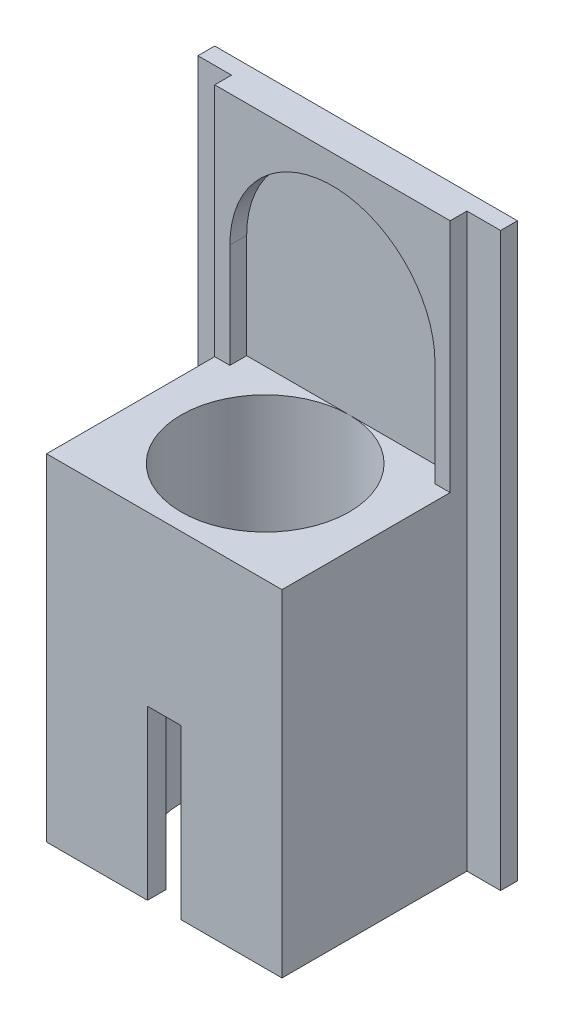
ISO-10303-21;
HEADER;
FILE_DESCRIPTION(('STEP AP214'),'2;1');
FILE_NAME('part.step','',(''),(''),'','','');
FILE_SCHEMA(('AUTOMOTIVE_DESIGN { 1 0 10303 214 1 1 1 1 }'));
ENDSEC;
DATA;
#1=APPLICATION_CONTEXT('core data for automotive mechanical design processes');
#2=APPLICATION_PROTOCOL_DEFINITION('international standard','automotive_design',2000,#1);
#3=PRODUCT_CONTEXT('',#1,'mechanical');
#4=PRODUCT('Part','Part','',(#3));
#5=PRODUCT_RELATED_PRODUCT_CATEGORY('part','',(#4));
#6=PRODUCT_DEFINITION_FORMATION('','',#4);
#7=PRODUCT_DEFINITION_CONTEXT('part definition',#1,'design');
#8=PRODUCT_DEFINITION('design','',#6,#7);
#9=PRODUCT_DEFINITION_SHAPE('','',#8);
#10=(LENGTH_UNIT() NAMED_UNIT(*) SI_UNIT(.MILLI.,.METRE.));
#11=(NAMED_UNIT(*) PLANE_ANGLE_UNIT() SI_UNIT($,.RADIAN.));
#12=(NAMED_UNIT(*) SI_UNIT($,.STERADIAN.) SOLID_ANGLE_UNIT());
#13=UNCERTAINTY_MEASURE_WITH_UNIT(LENGTH_MEASURE(1.E-05),#10,'distance_accuracy_value','');
#14=(GEOMETRIC_REPRESENTATION_CONTEXT(3) GLOBAL_UNCERTAINTY_ASSIGNED_CONTEXT((#13)) GLOBAL_UNIT_ASSIGNED_CONTEXT((#10,
#11,#12)) REPRESENTATION_CONTEXT('',''));
#15=CARTESIAN_POINT('',(0.,0.,0.));
#16=DIRECTION('',(0.,0.,1.));
#17=DIRECTION('',(1.,0.,0.));
#18=AXIS2_PLACEMENT_3D('',#15,#16,#17);
#19=CARTESIAN_POINT('',(0.,0.,5.));
#20=DIRECTION('',(0.,0.,1.));
#21=DIRECTION('',(1.,0.,0.));
#22=AXIS2_PLACEMENT_3D('',#19,#20,#21);
#23=PLANE('',#22);
#24=DIRECTION('',(0.,-1.,0.));
#25=VECTOR('',#24,1.);
#26=CARTESIAN_POINT('',(-745.51799096583,-670.769230769231,5.));
#27=LINE('',#26,#25);
#28=CARTESIAN_POINT('',(-745.51799096583,-500.769230769231,5.));
#29=VERTEX_POINT('',#28);
#30=CARTESIAN_POINT('',(-745.51799096583,-670.769230769231,5.));
#31=VERTEX_POINT('',#30);
#32=EDGE_CURVE('E37',#29,#31,#27,.T.);
#33=ORIENTED_EDGE('',*,*,#32,.F.);
#34=DIRECTION('',(-1.,0.,0.));
#35=VECTOR('',#34,1.);
#36=CARTESIAN_POINT('',(-755.51799096583,-500.769230769231,5.));
#37=LINE('',#36,#35);
#38=CARTESIAN_POINT('',(-755.51799096583,-500.769230769231,5.));
#39=VERTEX_POINT('',#38);
#40=EDGE_CURVE('E298',#29,#39,#37,.T.);
#41=ORIENTED_EDGE('',*,*,#40,.T.);
#42=DIRECTION('',(0.,-1.,0.));
#43=VECTOR('',#42,1.);
#44=CARTESIAN_POINT('',(-755.51799096583,-500.769230769231,5.));
#45=LINE('',#44,#43);
#46=CARTESIAN_POINT('',(-755.51799096583,-670.769230769231,5.));
#47=VERTEX_POINT('',#46);
#48=EDGE_CURVE('E265',#39,#47,#45,.T.);
#49=ORIENTED_EDGE('',*,*,#48,.T.);
#50=DIRECTION('',(1.,0.,0.));
#51=VECTOR('',#50,1.);
#52=CARTESIAN_POINT('',(-755.51799096583,-670.769230769231,5.));
#53=LINE('',#52,#51);
#54=EDGE_CURVE('E278',#47,#31,#53,.T.);
#55=ORIENTED_EDGE('',*,*,#54,.T.);
#56=EDGE_LOOP('',(#33,#41,#49,#55));
#57=FACE_BOUND('',#56,.T.);
#58=ADVANCED_FACE('F33',(#57),#23,.T.);
#59=CARTESIAN_POINT('',(-665.517990965831,-500.769230769231,5.));
#60=VERTEX_POINT('',#59);
#61=CARTESIAN_POINT('',(-675.51799096583,-500.769230769231,5.));
#62=VERTEX_POINT('',#61);
#63=EDGE_CURVE('E288',#60,#62,#37,.T.);
#64=ORIENTED_EDGE('',*,*,#63,.T.);
#65=DIRECTION('',(0.,1.,0.));
#66=VECTOR('',#65,1.);
#67=CARTESIAN_POINT('',(-675.517990965831,-670.769230769231,5.));
#68=LINE('',#67,#66);
#69=CARTESIAN_POINT('',(-675.517990965831,-670.769230769231,5.));
#70=VERTEX_POINT('',#69);
#71=EDGE_CURVE('E249',#70,#62,#68,.T.);
#72=ORIENTED_EDGE('',*,*,#71,.F.);
#73=CARTESIAN_POINT('',(-665.517990965831,-670.769230769231,5.));
#74=VERTEX_POINT('',#73);
#75=EDGE_CURVE('E268',#70,#74,#53,.T.);
#76=ORIENTED_EDGE('',*,*,#75,.T.);
#77=DIRECTION('',(0.,1.,0.));
#78=VECTOR('',#77,1.);
#79=CARTESIAN_POINT('',(-665.517990965831,-500.769230769231,5.));
#80=LINE('',#79,#78);
#81=EDGE_CURVE('E272',#74,#60,#80,.T.);
#82=ORIENTED_EDGE('',*,*,#81,.T.);
#83=EDGE_LOOP('',(#64,#72,#76,#82));
#84=FACE_BOUND('',#83,.T.);
#85=ADVANCED_FACE('F306',(#84),#23,.T.);
#86=CARTESIAN_POINT('',(-755.51799096583,-500.769230769231,5.));
#87=DIRECTION('',(1.,0.,0.));
#88=DIRECTION('',(0.,1.,0.));
#89=AXIS2_PLACEMENT_3D('',#86,#87,#88);
#90=PLANE('',#89);
#91=DIRECTION('',(0.,-1.,0.));
#92=VECTOR('',#91,1.);
#93=CARTESIAN_POINT('',(-755.51799096583,-500.769230769231,0.));
#94=LINE('',#93,#92);
#95=CARTESIAN_POINT('',(-755.51799096583,-500.769230769231,0.));
#96=VERTEX_POINT('',#95);
#97=CARTESIAN_POINT('',(-755.51799096583,-670.769230769231,0.));
#98=VERTEX_POINT('',#97);
#99=EDGE_CURVE('E294',#96,#98,#94,.T.);
#100=ORIENTED_EDGE('',*,*,#99,.T.);
#101=DIRECTION('',(0.,0.,-1.));
#102=VECTOR('',#101,1.);
#103=CARTESIAN_POINT('',(-755.51799096583,-670.769230769231,5.));
#104=LINE('',#103,#102);
#105=EDGE_CURVE('E11',#47,#98,#104,.T.);
#106=ORIENTED_EDGE('',*,*,#105,.F.);
#107=ORIENTED_EDGE('',*,*,#48,.F.);
#108=DIRECTION('',(0.,0.,-1.));
#109=VECTOR('',#108,1.);
#110=CARTESIAN_POINT('',(-755.51799096583,-500.769230769231,5.));
#111=LINE('',#110,#109);
#112=EDGE_CURVE('E285',#39,#96,#111,.T.);
#113=ORIENTED_EDGE('',*,*,#112,.T.);
#114=EDGE_LOOP('',(#100,#106,#107,#113));
#115=FACE_BOUND('',#114,.T.);
#116=ADVANCED_FACE('F35',(#115),#90,.F.);
#117=CARTESIAN_POINT('',(-755.51799096583,-670.769230769231,5.));
#118=DIRECTION('',(0.,1.,0.));
#119=DIRECTION('',(0.,0.,1.));
#120=AXIS2_PLACEMENT_3D('',#117,#118,#119);
#121=PLANE('',#120);
#122=CARTESIAN_POINT('',(-710.51799096583,-670.769230769231,30.));
#123=DIRECTION('',(0.,1.,0.));
#124=DIRECTION('',(0.,0.,1.));
#125=AXIS2_PLACEMENT_3D('',#122,#123,#124);
#126=CIRCLE('',#125,25.);
#127=CARTESIAN_POINT('',(-715.51799096583,-670.769230769231,54.4948974278318));
#128=VERTEX_POINT('',#127);
#129=CARTESIAN_POINT('',(-705.51799096583,-670.769230769231,54.4948974278318));
#130=VERTEX_POINT('',#129);
#131=EDGE_CURVE('E242',#128,#130,#126,.F.);
#132=ORIENTED_EDGE('',*,*,#131,.F.);
#133=DIRECTION('',(0.,0.,1.));
#134=VECTOR('',#133,1.);
#135=CARTESIAN_POINT('',(-715.51799096583,-670.769230769231,-0.001000000000001));
#136=LINE('',#135,#134);
#137=CARTESIAN_POINT('',(-715.51799096583,-670.769230769231,60.));
#138=VERTEX_POINT('',#137);
#139=EDGE_CURVE('E234',#128,#138,#136,.T.);
#140=ORIENTED_EDGE('',*,*,#139,.T.);
#141=DIRECTION('',(1.,0.,0.));
#142=VECTOR('',#141,1.);
#143=CARTESIAN_POINT('',(-745.51799096583,-670.769230769231,60.));
#144=LINE('',#143,#142);
#145=CARTESIAN_POINT('',(-745.51799096583,-670.769230769231,60.));
#146=VERTEX_POINT('',#145);
#147=EDGE_CURVE('E250',#146,#138,#144,.T.);
#148=ORIENTED_EDGE('',*,*,#147,.F.);
#149=DIRECTION('',(0.,0.,-1.));
#150=VECTOR('',#149,1.);
#151=CARTESIAN_POINT('',(-745.51799096583,-670.769230769231,60.));
#152=LINE('',#151,#150);
#153=EDGE_CURVE('E296',#146,#31,#152,.T.);
#154=ORIENTED_EDGE('',*,*,#153,.T.);
#155=ORIENTED_EDGE('',*,*,#54,.F.);
#156=ORIENTED_EDGE('',*,*,#105,.T.);
#157=DIRECTION('',(1.,0.,0.));
#158=VECTOR('',#157,1.);
#159=CARTESIAN_POINT('',(-755.51799096583,-670.769230769231,0.));
#160=LINE('',#159,#158);
#161=CARTESIAN_POINT('',(-665.517990965831,-670.769230769231,0.));
#162=VERTEX_POINT('',#161);
#163=EDGE_CURVE('E292',#98,#162,#160,.T.);
#164=ORIENTED_EDGE('',*,*,#163,.T.);
#165=DIRECTION('',(0.,0.,-1.));
#166=VECTOR('',#165,1.);
#167=CARTESIAN_POINT('',(-665.517990965831,-670.769230769231,5.));
#168=LINE('',#167,#166);
#169=EDGE_CURVE('E43',#74,#162,#168,.T.);
#170=ORIENTED_EDGE('',*,*,#169,.F.);
#171=ORIENTED_EDGE('',*,*,#75,.F.);
#172=DIRECTION('',(0.,0.,-1.));
#173=VECTOR('',#172,1.);
#174=CARTESIAN_POINT('',(-675.517990965831,-670.769230769231,60.));
#175=LINE('',#174,#173);
#176=CARTESIAN_POINT('',(-675.517990965831,-670.769230769231,60.));
#177=VERTEX_POINT('',#176);
#178=EDGE_CURVE('E264',#177,#70,#175,.T.);
#179=ORIENTED_EDGE('',*,*,#178,.F.);
#180=CARTESIAN_POINT('',(-705.51799096583,-670.769230769231,60.));
#181=VERTEX_POINT('',#180);
#182=EDGE_CURVE('E248',#181,#177,#144,.T.);
#183=ORIENTED_EDGE('',*,*,#182,.F.);
#184=DIRECTION('',(0.,0.,1.));
#185=VECTOR('',#184,1.);
#186=CARTESIAN_POINT('',(-705.51799096583,-670.769230769231,-0.001000000000001));
#187=LINE('',#186,#185);
#188=EDGE_CURVE('E231',#130,#181,#187,.T.);
#189=ORIENTED_EDGE('',*,*,#188,.F.);
#190=EDGE_LOOP('',(#132,#140,#148,#154,#155,#156,#164,#170,#171,#179,#183,#189));
#191=FACE_BOUND('',#190,.T.);
#192=ADVANCED_FACE('F337',(#191),#121,.F.);
#193=CARTESIAN_POINT('',(-665.517990965831,-500.769230769231,5.));
#194=DIRECTION('',(-1.,0.,0.));
#195=DIRECTION('',(0.,0.,1.));
#196=AXIS2_PLACEMENT_3D('',#193,#194,#195);
#197=PLANE('',#196);
#198=DIRECTION('',(0.,1.,0.));
#199=VECTOR('',#198,1.);
#200=CARTESIAN_POINT('',(-665.517990965831,-500.769230769231,0.));
#201=LINE('',#200,#199);
#202=CARTESIAN_POINT('',(-665.517990965831,-500.769230769231,0.));
#203=VERTEX_POINT('',#202);
#204=EDGE_CURVE('E290',#162,#203,#201,.T.);
#205=ORIENTED_EDGE('',*,*,#204,.T.);
#206=DIRECTION('',(0.,0.,-1.));
#207=VECTOR('',#206,1.);
#208=CARTESIAN_POINT('',(-665.517990965831,-500.769230769231,5.));
#209=LINE('',#208,#207);
#210=EDGE_CURVE('E282',#60,#203,#209,.T.);
#211=ORIENTED_EDGE('',*,*,#210,.F.);
#212=ORIENTED_EDGE('',*,*,#81,.F.);
#213=ORIENTED_EDGE('',*,*,#169,.T.);
#214=EDGE_LOOP('',(#205,#211,#212,#213));
#215=FACE_BOUND('',#214,.T.);
#216=ADVANCED_FACE('F310',(#215),#197,.F.);
#217=CARTESIAN_POINT('',(-755.51799096583,-500.769230769231,5.));
#218=DIRECTION('',(0.,-1.,0.));
#219=DIRECTION('',(0.,0.,-1.));
#220=AXIS2_PLACEMENT_3D('',#217,#218,#219);
#221=PLANE('',#220);
#222=DIRECTION('',(-1.,0.,0.));
#223=VECTOR('',#222,1.);
#224=CARTESIAN_POINT('',(-755.51799096583,-500.769230769231,0.));
#225=LINE('',#224,#223);
#226=EDGE_CURVE('E269',#203,#96,#225,.T.);
#227=ORIENTED_EDGE('',*,*,#226,.T.);
#228=ORIENTED_EDGE('',*,*,#112,.F.);
#229=ORIENTED_EDGE('',*,*,#40,.F.);
#230=DIRECTION('',(0.,0.,-1.));
#231=VECTOR('',#230,1.);
#232=CARTESIAN_POINT('',(-745.51799096583,-500.769230769231,10.));
#233=LINE('',#232,#231);
#234=CARTESIAN_POINT('',(-745.51799096583,-500.769230769231,10.));
#235=VERTEX_POINT('',#234);
#236=EDGE_CURVE('E210',#235,#29,#233,.T.);
#237=ORIENTED_EDGE('',*,*,#236,.F.);
#238=DIRECTION('',(-1.,0.,0.));
#239=VECTOR('',#238,1.);
#240=CARTESIAN_POINT('',(-745.51799096583,-500.769230769231,10.));
#241=LINE('',#240,#239);
#242=CARTESIAN_POINT('',(-675.51799096583,-500.769230769231,10.));
#243=VERTEX_POINT('',#242);
#244=EDGE_CURVE('E208',#243,#235,#241,.T.);
#245=ORIENTED_EDGE('',*,*,#244,.F.);
#246=DIRECTION('',(0.,0.,-1.));
#247=VECTOR('',#246,1.);
#248=CARTESIAN_POINT('',(-675.51799096583,-500.769230769231,10.));
#249=LINE('',#248,#247);
#250=EDGE_CURVE('E213',#243,#62,#249,.T.);
#251=ORIENTED_EDGE('',*,*,#250,.T.);
#252=ORIENTED_EDGE('',*,*,#63,.F.);
#253=ORIENTED_EDGE('',*,*,#210,.T.);
#254=EDGE_LOOP('',(#227,#228,#229,#237,#245,#251,#252,#253));
#255=FACE_BOUND('',#254,.T.);
#256=ADVANCED_FACE('F314',(#255),#221,.F.);
#257=CARTESIAN_POINT('',(0.,0.,0.));
#258=DIRECTION('',(0.,0.,1.));
#259=DIRECTION('',(1.,0.,0.));
#260=AXIS2_PLACEMENT_3D('',#257,#258,#259);
#261=PLANE('',#260);
#262=ORIENTED_EDGE('',*,*,#99,.F.);
#263=ORIENTED_EDGE('',*,*,#226,.F.);
#264=ORIENTED_EDGE('',*,*,#204,.F.);
#265=ORIENTED_EDGE('',*,*,#163,.F.);
#266=EDGE_LOOP('',(#262,#263,#264,#265));
#267=FACE_BOUND('',#266,.T.);
#268=ADVANCED_FACE('F347',(#267),#261,.F.);
#269=CARTESIAN_POINT('',(-745.51799096583,-670.769230769231,60.));
#270=DIRECTION('',(1.,0.,0.));
#271=DIRECTION('',(0.,0.,-1.));
#272=AXIS2_PLACEMENT_3D('',#269,#270,#271);
#273=PLANE('',#272);
#274=ORIENTED_EDGE('',*,*,#32,.T.);
#275=ORIENTED_EDGE('',*,*,#153,.F.);
#276=DIRECTION('',(0.,-1.,0.));
#277=VECTOR('',#276,1.);
#278=CARTESIAN_POINT('',(-745.51799096583,-670.769230769231,60.));
#279=LINE('',#278,#277);
#280=CARTESIAN_POINT('',(-745.51799096583,-570.76923076923,60.));
#281=VERTEX_POINT('',#280);
#282=EDGE_CURVE('E245',#281,#146,#279,.T.);
#283=ORIENTED_EDGE('',*,*,#282,.F.);
#284=DIRECTION('',(0.,0.,-1.));
#285=VECTOR('',#284,1.);
#286=CARTESIAN_POINT('',(-745.51799096583,-570.76923076923,60.));
#287=LINE('',#286,#285);
#288=CARTESIAN_POINT('',(-745.51799096583,-570.76923076923,10.));
#289=VERTEX_POINT('',#288);
#290=EDGE_CURVE('E256',#281,#289,#287,.T.);
#291=ORIENTED_EDGE('',*,*,#290,.T.);
#292=DIRECTION('',(0.,-1.,0.));
#293=VECTOR('',#292,1.);
#294=CARTESIAN_POINT('',(-745.51799096583,-500.769230769231,10.));
#295=LINE('',#294,#293);
#296=EDGE_CURVE('E197',#235,#289,#295,.T.);
#297=ORIENTED_EDGE('',*,*,#296,.F.);
#298=ORIENTED_EDGE('',*,*,#236,.T.);
#299=EDGE_LOOP('',(#274,#275,#283,#291,#297,#298));
#300=FACE_BOUND('',#299,.T.);
#301=ADVANCED_FACE('F340',(#300),#273,.F.);
#302=CARTESIAN_POINT('',(-675.517990965831,-670.769230769231,60.));
#303=DIRECTION('',(-1.,0.,0.));
#304=DIRECTION('',(0.,0.,1.));
#305=AXIS2_PLACEMENT_3D('',#302,#303,#304);
#306=PLANE('',#305);
#307=ORIENTED_EDGE('',*,*,#71,.T.);
#308=ORIENTED_EDGE('',*,*,#250,.F.);
#309=DIRECTION('',(0.,1.,0.));
#310=VECTOR('',#309,1.);
#311=CARTESIAN_POINT('',(-675.51799096583,-500.769230769231,10.));
#312=LINE('',#311,#310);
#313=CARTESIAN_POINT('',(-675.51799096583,-570.76923076923,10.));
#314=VERTEX_POINT('',#313);
#315=EDGE_CURVE('E206',#314,#243,#312,.T.);
#316=ORIENTED_EDGE('',*,*,#315,.F.);
#317=DIRECTION('',(0.,0.,-1.));
#318=VECTOR('',#317,1.);
#319=CARTESIAN_POINT('',(-675.517990965831,-570.76923076923,60.));
#320=LINE('',#319,#318);
#321=CARTESIAN_POINT('',(-675.517990965831,-570.76923076923,60.));
#322=VERTEX_POINT('',#321);
#323=EDGE_CURVE('E261',#322,#314,#320,.T.);
#324=ORIENTED_EDGE('',*,*,#323,.F.);
#325=DIRECTION('',(0.,1.,0.));
#326=VECTOR('',#325,1.);
#327=CARTESIAN_POINT('',(-675.517990965831,-670.769230769231,60.));
#328=LINE('',#327,#326);
#329=EDGE_CURVE('E253',#177,#322,#328,.T.);
#330=ORIENTED_EDGE('',*,*,#329,.F.);
#331=ORIENTED_EDGE('',*,*,#178,.T.);
#332=EDGE_LOOP('',(#307,#308,#316,#324,#330,#331));
#333=FACE_BOUND('',#332,.T.);
#334=ADVANCED_FACE('F320',(#333),#306,.F.);
#335=CARTESIAN_POINT('',(-745.51799096583,-570.76923076923,60.));
#336=DIRECTION('',(0.,-1.,0.));
#337=DIRECTION('',(0.,0.,-1.));
#338=AXIS2_PLACEMENT_3D('',#335,#336,#337);
#339=PLANE('',#338);
#340=ORIENTED_EDGE('',*,*,#323,.T.);
#341=DIRECTION('',(1.,0.,0.));
#342=VECTOR('',#341,1.);
#343=CARTESIAN_POINT('',(-745.51799096583,-570.76923076923,10.));
#344=LINE('',#343,#342);
#345=CARTESIAN_POINT('',(-680.01799096583,-570.76923076923,10.));
#346=VERTEX_POINT('',#345);
#347=EDGE_CURVE('E202',#346,#314,#344,.T.);
#348=ORIENTED_EDGE('',*,*,#347,.F.);
#349=DIRECTION('',(0.,0.,1.));
#350=VECTOR('',#349,1.);
#351=CARTESIAN_POINT('',(-680.01799096583,-570.76923076923,5.));
#352=LINE('',#351,#350);
#353=CARTESIAN_POINT('',(-680.01799096583,-570.76923076923,5.));
#354=VERTEX_POINT('',#353);
#355=EDGE_CURVE('E198',#354,#346,#352,.T.);
#356=ORIENTED_EDGE('',*,*,#355,.F.);
#357=DIRECTION('',(1.,0.,0.));
#358=VECTOR('',#357,1.);
#359=CARTESIAN_POINT('',(-741.017990965831,-570.76923076923,5.));
#360=LINE('',#359,#358);
#361=CARTESIAN_POINT('',(-710.51799096583,-570.76923076923,5.));
#362=VERTEX_POINT('',#361);
#363=EDGE_CURVE('E180',#362,#354,#360,.T.);
#364=ORIENTED_EDGE('',*,*,#363,.F.);
#365=CARTESIAN_POINT('',(-710.51799096583,-570.76923076923,30.));
#366=DIRECTION('',(0.,1.,0.));
#367=DIRECTION('',(0.,0.,1.));
#368=AXIS2_PLACEMENT_3D('',#365,#366,#367);
#369=CIRCLE('',#368,25.);
#370=EDGE_CURVE('E239',#362,#362,#369,.T.);
#371=ORIENTED_EDGE('',*,*,#370,.F.);
#372=CARTESIAN_POINT('',(-741.017990965831,-570.76923076923,5.));
#373=VERTEX_POINT('',#372);
#374=EDGE_CURVE('E190',#373,#362,#360,.T.);
#375=ORIENTED_EDGE('',*,*,#374,.F.);
#376=DIRECTION('',(0.,0.,1.));
#377=VECTOR('',#376,1.);
#378=CARTESIAN_POINT('',(-741.017990965831,-570.76923076923,5.));
#379=LINE('',#378,#377);
#380=CARTESIAN_POINT('',(-741.017990965831,-570.76923076923,10.));
#381=VERTEX_POINT('',#380);
#382=EDGE_CURVE('E171',#373,#381,#379,.T.);
#383=ORIENTED_EDGE('',*,*,#382,.T.);
#384=EDGE_CURVE('E203',#289,#381,#344,.T.);
#385=ORIENTED_EDGE('',*,*,#384,.F.);
#386=ORIENTED_EDGE('',*,*,#290,.F.);
#387=DIRECTION('',(-1.,0.,0.));
#388=VECTOR('',#387,1.);
#389=CARTESIAN_POINT('',(-745.51799096583,-570.76923076923,60.));
#390=LINE('',#389,#388);
#391=EDGE_CURVE('E255',#322,#281,#390,.T.);
#392=ORIENTED_EDGE('',*,*,#391,.F.);
#393=EDGE_LOOP('',(#340,#348,#356,#364,#371,#375,#383,#385,#386,#392));
#394=FACE_BOUND('',#393,.T.);
#395=ADVANCED_FACE('F354',(#394),#339,.F.);
#396=CARTESIAN_POINT('',(0.,0.,60.));
#397=DIRECTION('',(0.,0.,-1.));
#398=DIRECTION('',(-1.,0.,0.));
#399=AXIS2_PLACEMENT_3D('',#396,#397,#398);
#400=PLANE('',#399);
#401=ORIENTED_EDGE('',*,*,#147,.T.);
#402=DIRECTION('',(0.,-1.,0.));
#403=VECTOR('',#402,1.);
#404=CARTESIAN_POINT('',(-715.51799096583,-620.76923076923,60.));
#405=LINE('',#404,#403);
#406=CARTESIAN_POINT('',(-715.51799096583,-620.76923076923,60.));
#407=VERTEX_POINT('',#406);
#408=EDGE_CURVE('E216',#407,#138,#405,.T.);
#409=ORIENTED_EDGE('',*,*,#408,.F.);
#410=DIRECTION('',(-1.,0.,0.));
#411=VECTOR('',#410,1.);
#412=CARTESIAN_POINT('',(-705.51799096583,-620.76923076923,60.));
#413=LINE('',#412,#411);
#414=CARTESIAN_POINT('',(-705.51799096583,-620.76923076923,60.));
#415=VERTEX_POINT('',#414);
#416=EDGE_CURVE('E219',#415,#407,#413,.T.);
#417=ORIENTED_EDGE('',*,*,#416,.F.);
#418=DIRECTION('',(0.,1.,0.));
#419=VECTOR('',#418,1.);
#420=CARTESIAN_POINT('',(-705.51799096583,-620.76923076923,60.));
#421=LINE('',#420,#419);
#422=EDGE_CURVE('E222',#181,#415,#421,.T.);
#423=ORIENTED_EDGE('',*,*,#422,.F.);
#424=ORIENTED_EDGE('',*,*,#182,.T.);
#425=ORIENTED_EDGE('',*,*,#329,.T.);
#426=ORIENTED_EDGE('',*,*,#391,.T.);
#427=ORIENTED_EDGE('',*,*,#282,.T.);
#428=EDGE_LOOP('',(#401,#409,#417,#423,#424,#425,#426,#427));
#429=FACE_BOUND('',#428,.T.);
#430=ADVANCED_FACE('F361',(#429),#400,.F.);
#431=CARTESIAN_POINT('',(-710.51799096583,-670.770280769231,30.));
#432=DIRECTION('',(0.,1.,0.));
#433=DIRECTION('',(0.,0.,1.));
#434=AXIS2_PLACEMENT_3D('',#431,#432,#433);
#435=CYLINDRICAL_SURFACE('',#434,25.);
#436=ORIENTED_EDGE('',*,*,#370,.T.);
#437=EDGE_LOOP('',(#436));
#438=FACE_BOUND('',#437,.T.);
#439=CARTESIAN_POINT('',(-710.51799096583,-620.76923076923,30.));
#440=DIRECTION('',(0.,1.,0.));
#441=DIRECTION('',(0.,0.,1.));
#442=AXIS2_PLACEMENT_3D('',#439,#440,#441);
#443=CIRCLE('',#442,25.);
#444=CARTESIAN_POINT('',(-715.51799096583,-620.76923076923,54.4948974278318));
#445=VERTEX_POINT('',#444);
#446=CARTESIAN_POINT('',(-705.51799096583,-620.76923076923,54.4948974278318));
#447=VERTEX_POINT('',#446);
#448=EDGE_CURVE('E59',#445,#447,#443,.T.);
#449=ORIENTED_EDGE('',*,*,#448,.F.);
#450=DIRECTION('',(0.,1.,0.));
#451=VECTOR('',#450,1.);
#452=CARTESIAN_POINT('',(-715.51799096583,-670.770280769231,54.4948974278318));
#453=LINE('',#452,#451);
#454=EDGE_CURVE('E225',#128,#445,#453,.T.);
#455=ORIENTED_EDGE('',*,*,#454,.F.);
#456=ORIENTED_EDGE('',*,*,#131,.T.);
#457=DIRECTION('',(0.,1.,0.));
#458=VECTOR('',#457,1.);
#459=CARTESIAN_POINT('',(-705.51799096583,-670.770280769231,54.4948974278318));
#460=LINE('',#459,#458);
#461=EDGE_CURVE('E226',#447,#130,#460,.F.);
#462=ORIENTED_EDGE('',*,*,#461,.F.);
#463=EDGE_LOOP('',(#449,#455,#456,#462));
#464=FACE_BOUND('',#463,.T.);
#465=ADVANCED_FACE('F370',(#438,#464),#435,.F.);
#466=CARTESIAN_POINT('',(-705.51799096583,-620.76923076923,-0.001000000000001));
#467=DIRECTION('',(0.,1.,0.));
#468=DIRECTION('',(0.,0.,1.));
#469=AXIS2_PLACEMENT_3D('',#466,#467,#468);
#470=PLANE('',#469);
#471=ORIENTED_EDGE('',*,*,#448,.T.);
#472=DIRECTION('',(0.,0.,1.));
#473=VECTOR('',#472,1.);
#474=CARTESIAN_POINT('',(-705.51799096583,-620.76923076923,-0.001000000000001));
#475=LINE('',#474,#473);
#476=EDGE_CURVE('E233',#447,#415,#475,.T.);
#477=ORIENTED_EDGE('',*,*,#476,.T.);
#478=ORIENTED_EDGE('',*,*,#416,.T.);
#479=DIRECTION('',(0.,0.,1.));
#480=VECTOR('',#479,1.);
#481=CARTESIAN_POINT('',(-715.51799096583,-620.76923076923,-0.001000000000001));
#482=LINE('',#481,#480);
#483=EDGE_CURVE('E218',#445,#407,#482,.T.);
#484=ORIENTED_EDGE('',*,*,#483,.F.);
#485=EDGE_LOOP('',(#471,#477,#478,#484));
#486=FACE_BOUND('',#485,.T.);
#487=ADVANCED_FACE('F374',(#486),#470,.F.);
#488=CARTESIAN_POINT('',(-715.51799096583,-620.76923076923,-0.001000000000001));
#489=DIRECTION('',(-1.,0.,0.));
#490=DIRECTION('',(0.,0.,1.));
#491=AXIS2_PLACEMENT_3D('',#488,#489,#490);
#492=PLANE('',#491);
#493=ORIENTED_EDGE('',*,*,#454,.T.);
#494=ORIENTED_EDGE('',*,*,#483,.T.);
#495=ORIENTED_EDGE('',*,*,#408,.T.);
#496=ORIENTED_EDGE('',*,*,#139,.F.);
#497=EDGE_LOOP('',(#493,#494,#495,#496));
#498=FACE_BOUND('',#497,.T.);
#499=ADVANCED_FACE('F372',(#498),#492,.F.);
#500=CARTESIAN_POINT('',(-705.51799096583,-620.76923076923,-0.001000000000001));
#501=DIRECTION('',(1.,0.,0.));
#502=DIRECTION('',(0.,0.,-1.));
#503=AXIS2_PLACEMENT_3D('',#500,#501,#502);
#504=PLANE('',#503);
#505=ORIENTED_EDGE('',*,*,#461,.T.);
#506=ORIENTED_EDGE('',*,*,#188,.T.);
#507=ORIENTED_EDGE('',*,*,#422,.T.);
#508=ORIENTED_EDGE('',*,*,#476,.F.);
#509=EDGE_LOOP('',(#505,#506,#507,#508));
#510=FACE_BOUND('',#509,.T.);
#511=ADVANCED_FACE('F375',(#510),#504,.F.);
#512=CARTESIAN_POINT('',(0.,0.,10.));
#513=DIRECTION('',(0.,0.,1.));
#514=DIRECTION('',(1.,0.,0.));
#515=AXIS2_PLACEMENT_3D('',#512,#513,#514);
#516=PLANE('',#515);
#517=DIRECTION('',(0.,1.,0.));
#518=VECTOR('',#517,1.);
#519=CARTESIAN_POINT('',(-680.01799096583,-539.76923076923,10.));
#520=LINE('',#519,#518);
#521=CARTESIAN_POINT('',(-680.01799096583,-539.76923076923,10.));
#522=VERTEX_POINT('',#521);
#523=EDGE_CURVE('E184',#346,#522,#520,.T.);
#524=ORIENTED_EDGE('',*,*,#523,.F.);
#525=ORIENTED_EDGE('',*,*,#347,.T.);
#526=ORIENTED_EDGE('',*,*,#315,.T.);
#527=ORIENTED_EDGE('',*,*,#244,.T.);
#528=ORIENTED_EDGE('',*,*,#296,.T.);
#529=ORIENTED_EDGE('',*,*,#384,.T.);
#530=DIRECTION('',(0.,-1.,0.));
#531=VECTOR('',#530,1.);
#532=CARTESIAN_POINT('',(-741.017990965831,-539.76923076923,10.));
#533=LINE('',#532,#531);
#534=CARTESIAN_POINT('',(-741.017990965831,-539.76923076923,10.));
#535=VERTEX_POINT('',#534);
#536=EDGE_CURVE('E187',#535,#381,#533,.T.);
#537=ORIENTED_EDGE('',*,*,#536,.F.);
#538=CARTESIAN_POINT('',(-710.51799096583,-539.76923076923,10.));
#539=DIRECTION('',(0.,0.,1.));
#540=DIRECTION('',(-1.,0.,0.));
#541=AXIS2_PLACEMENT_3D('',#538,#539,#540);
#542=CIRCLE('',#541,30.5);
#543=EDGE_CURVE('E51',#522,#535,#542,.T.);
#544=ORIENTED_EDGE('',*,*,#543,.F.);
#545=EDGE_LOOP('',(#524,#525,#526,#527,#528,#529,#537,#544));
#546=FACE_BOUND('',#545,.T.);
#547=ADVANCED_FACE('F352',(#546),#516,.T.);
#548=CARTESIAN_POINT('',(-710.51799096583,-539.76923076923,5.));
#549=DIRECTION('',(0.,0.,1.));
#550=DIRECTION('',(1.,0.,0.));
#551=AXIS2_PLACEMENT_3D('',#548,#549,#550);
#552=CYLINDRICAL_SURFACE('',#551,30.5);
#553=ORIENTED_EDGE('',*,*,#543,.T.);
#554=DIRECTION('',(0.,0.,1.));
#555=VECTOR('',#554,1.);
#556=CARTESIAN_POINT('',(-741.017990965831,-539.76923076923,5.));
#557=LINE('',#556,#555);
#558=CARTESIAN_POINT('',(-741.017990965831,-539.76923076923,5.));
#559=VERTEX_POINT('',#558);
#560=EDGE_CURVE('E162',#559,#535,#557,.T.);
#561=ORIENTED_EDGE('',*,*,#560,.F.);
#562=CARTESIAN_POINT('',(-710.51799096583,-539.76923076923,5.));
#563=DIRECTION('',(0.,0.,1.));
#564=DIRECTION('',(-1.,0.,0.));
#565=AXIS2_PLACEMENT_3D('',#562,#563,#564);
#566=CIRCLE('',#565,30.5);
#567=CARTESIAN_POINT('',(-680.01799096583,-539.76923076923,5.));
#568=VERTEX_POINT('',#567);
#569=EDGE_CURVE('E166',#568,#559,#566,.T.);
#570=ORIENTED_EDGE('',*,*,#569,.F.);
#571=DIRECTION('',(0.,0.,1.));
#572=VECTOR('',#571,1.);
#573=CARTESIAN_POINT('',(-680.01799096583,-539.76923076923,5.));
#574=LINE('',#573,#572);
#575=EDGE_CURVE('E195',#568,#522,#574,.T.);
#576=ORIENTED_EDGE('',*,*,#575,.T.);
#577=EDGE_LOOP('',(#553,#561,#570,#576));
#578=FACE_BOUND('',#577,.T.);
#579=ADVANCED_FACE('F164',(#578),#552,.F.);
#580=CARTESIAN_POINT('',(-680.01799096583,-539.76923076923,5.));
#581=DIRECTION('',(1.,0.,0.));
#582=DIRECTION('',(0.,0.,-1.));
#583=AXIS2_PLACEMENT_3D('',#580,#581,#582);
#584=PLANE('',#583);
#585=ORIENTED_EDGE('',*,*,#523,.T.);
#586=ORIENTED_EDGE('',*,*,#575,.F.);
#587=DIRECTION('',(0.,1.,0.));
#588=VECTOR('',#587,1.);
#589=CARTESIAN_POINT('',(-680.01799096583,-539.76923076923,5.));
#590=LINE('',#589,#588);
#591=EDGE_CURVE('E172',#354,#568,#590,.T.);
#592=ORIENTED_EDGE('',*,*,#591,.F.);
#593=ORIENTED_EDGE('',*,*,#355,.T.);
#594=EDGE_LOOP('',(#585,#586,#592,#593));
#595=FACE_BOUND('',#594,.T.);
#596=ADVANCED_FACE('F471',(#595),#584,.F.);
#597=CARTESIAN_POINT('',(-741.017990965831,-539.76923076923,5.));
#598=DIRECTION('',(-1.,0.,0.));
#599=DIRECTION('',(0.,0.,1.));
#600=AXIS2_PLACEMENT_3D('',#597,#598,#599);
#601=PLANE('',#600);
#602=ORIENTED_EDGE('',*,*,#536,.T.);
#603=ORIENTED_EDGE('',*,*,#382,.F.);
#604=DIRECTION('',(0.,-1.,0.));
#605=VECTOR('',#604,1.);
#606=CARTESIAN_POINT('',(-741.017990965831,-539.76923076923,5.));
#607=LINE('',#606,#605);
#608=EDGE_CURVE('E175',#559,#373,#607,.T.);
#609=ORIENTED_EDGE('',*,*,#608,.F.);
#610=ORIENTED_EDGE('',*,*,#560,.T.);
#611=EDGE_LOOP('',(#602,#603,#609,#610));
#612=FACE_BOUND('',#611,.T.);
#613=ADVANCED_FACE('F176',(#612),#601,.F.);
#614=CARTESIAN_POINT('',(-710.51799096583,-539.76923076923,5.));
#615=DIRECTION('',(0.,0.,-1.));
#616=DIRECTION('',(-1.,0.,0.));
#617=AXIS2_PLACEMENT_3D('',#614,#615,#616);
#618=PLANE('',#617);
#619=ORIENTED_EDGE('',*,*,#569,.T.);
#620=ORIENTED_EDGE('',*,*,#608,.T.);
#621=ORIENTED_EDGE('',*,*,#374,.T.);
#622=ORIENTED_EDGE('',*,*,#363,.T.);
#623=ORIENTED_EDGE('',*,*,#591,.T.);
#624=EDGE_LOOP('',(#619,#620,#621,#622,#623));
#625=FACE_BOUND('',#624,.T.);
#626=ADVANCED_FACE('F182',(#625),#618,.F.);
#627=CLOSED_SHELL('',(#58,#85,#116,#192,#216,#256,#268,#301,#334,#395,#430,#465,#487,#499,#511,
#547,#579,#596,#613,#626));
#628=MANIFOLD_SOLID_BREP('B2',#627);
#629=ADVANCED_BREP_SHAPE_REPRESENTATION('',(#18,#628),#14);
#630=SHAPE_DEFINITION_REPRESENTATION(#9,#629);
ENDSEC;
END-ISO-10303-21;
